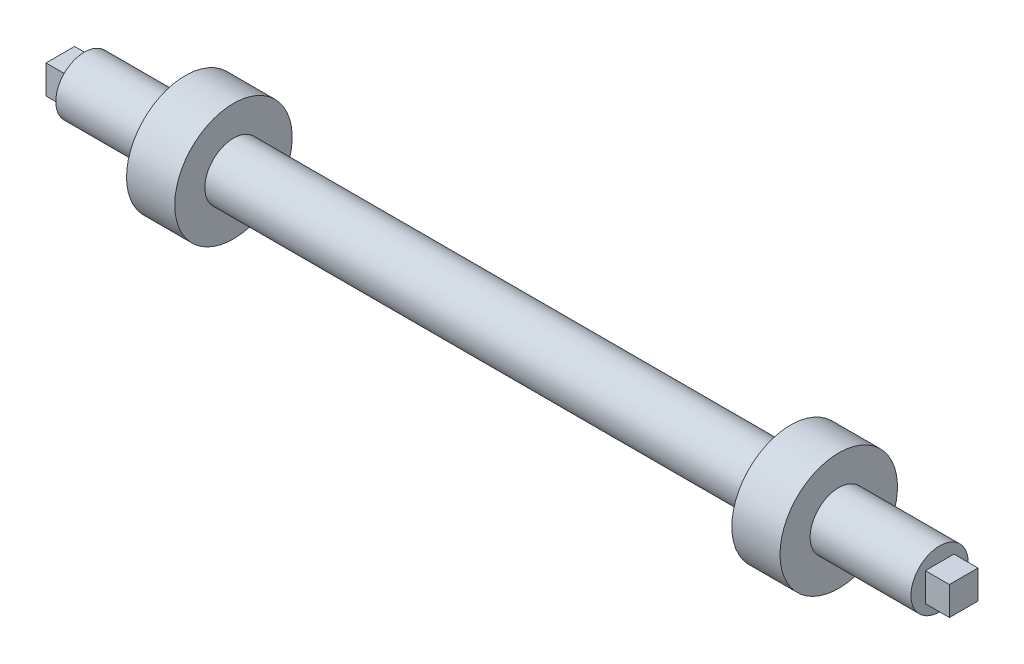
ISO-10303-21;
HEADER;
FILE_DESCRIPTION(('STEP AP214'),'2;1');
FILE_NAME('part.step','',(''),(''),'','','');
FILE_SCHEMA(('AUTOMOTIVE_DESIGN { 1 0 10303 214 1 1 1 1 }'));
ENDSEC;
DATA;
#1=APPLICATION_CONTEXT('core data for automotive mechanical design processes');
#2=APPLICATION_PROTOCOL_DEFINITION('international standard','automotive_design',2000,#1);
#3=PRODUCT_CONTEXT('',#1,'mechanical');
#4=PRODUCT('Part','Part','',(#3));
#5=PRODUCT_RELATED_PRODUCT_CATEGORY('part','',(#4));
#6=PRODUCT_DEFINITION_FORMATION('','',#4);
#7=PRODUCT_DEFINITION_CONTEXT('part definition',#1,'design');
#8=PRODUCT_DEFINITION('design','',#6,#7);
#9=PRODUCT_DEFINITION_SHAPE('','',#8);
#10=(LENGTH_UNIT() NAMED_UNIT(*) SI_UNIT(.MILLI.,.METRE.));
#11=(NAMED_UNIT(*) PLANE_ANGLE_UNIT() SI_UNIT($,.RADIAN.));
#12=(NAMED_UNIT(*) SI_UNIT($,.STERADIAN.) SOLID_ANGLE_UNIT());
#13=UNCERTAINTY_MEASURE_WITH_UNIT(LENGTH_MEASURE(1.E-05),#10,'distance_accuracy_value','');
#14=(GEOMETRIC_REPRESENTATION_CONTEXT(3) GLOBAL_UNCERTAINTY_ASSIGNED_CONTEXT((#13)) GLOBAL_UNIT_ASSIGNED_CONTEXT((#10,
#11,#12)) REPRESENTATION_CONTEXT('',''));
#15=CARTESIAN_POINT('',(0.,0.,0.));
#16=DIRECTION('',(0.,0.,1.));
#17=DIRECTION('',(1.,0.,0.));
#18=AXIS2_PLACEMENT_3D('',#15,#16,#17);
#19=CARTESIAN_POINT('',(0.,0.,-4.75));
#20=DIRECTION('',(-1.,0.,0.));
#21=DIRECTION('',(0.,0.,1.));
#22=AXIS2_PLACEMENT_3D('',#19,#20,#21);
#23=CYLINDRICAL_SURFACE('',#22,4.75);
#24=CARTESIAN_POINT('',(16.75,0.,-4.75));
#25=DIRECTION('',(-1.,0.,0.));
#26=DIRECTION('',(0.,0.,1.));
#27=AXIS2_PLACEMENT_3D('',#24,#25,#26);
#28=CIRCLE('',#27,4.75);
#29=CARTESIAN_POINT('',(16.75,0.,0.));
#30=VERTEX_POINT('',#29);
#31=EDGE_CURVE('E171',#30,#30,#28,.T.);
#32=ORIENTED_EDGE('',*,*,#31,.T.);
#33=EDGE_LOOP('',(#32));
#34=FACE_BOUND('',#33,.T.);
#35=CARTESIAN_POINT('',(0.,0.,-4.75));
#36=DIRECTION('',(-1.,0.,0.));
#37=DIRECTION('',(0.,0.,1.));
#38=AXIS2_PLACEMENT_3D('',#35,#36,#37);
#39=CIRCLE('',#38,4.75);
#40=CARTESIAN_POINT('',(0.,0.,0.));
#41=VERTEX_POINT('',#40);
#42=EDGE_CURVE('E11',#41,#41,#39,.T.);
#43=ORIENTED_EDGE('',*,*,#42,.F.);
#44=EDGE_LOOP('',(#43));
#45=FACE_BOUND('',#44,.T.);
#46=ADVANCED_FACE('F38',(#34,#45),#23,.T.);
#47=CARTESIAN_POINT('',(0.,0.,0.));
#48=DIRECTION('',(-1.,0.,0.));
#49=DIRECTION('',(0.,0.,1.));
#50=AXIS2_PLACEMENT_3D('',#47,#48,#49);
#51=PLANE('',#50);
#52=DIRECTION('',(0.,0.,-1.));
#53=VECTOR('',#52,1.);
#54=CARTESIAN_POINT('',(0.,2.375,-4.75));
#55=LINE('',#54,#53);
#56=CARTESIAN_POINT('',(0.,2.375,-2.375));
#57=VERTEX_POINT('',#56);
#58=CARTESIAN_POINT('',(0.,2.375,-7.125));
#59=VERTEX_POINT('',#58);
#60=EDGE_CURVE('E52',#57,#59,#55,.T.);
#61=ORIENTED_EDGE('',*,*,#60,.F.);
#62=DIRECTION('',(0.,1.,0.));
#63=VECTOR('',#62,1.);
#64=CARTESIAN_POINT('',(0.,-2.375,-2.375));
#65=LINE('',#64,#63);
#66=CARTESIAN_POINT('',(0.,-2.375,-2.375));
#67=VERTEX_POINT('',#66);
#68=EDGE_CURVE('E56',#67,#57,#65,.T.);
#69=ORIENTED_EDGE('',*,*,#68,.F.);
#70=DIRECTION('',(0.,0.,1.));
#71=VECTOR('',#70,1.);
#72=CARTESIAN_POINT('',(0.,-2.375,-7.125));
#73=LINE('',#72,#71);
#74=CARTESIAN_POINT('',(0.,-2.375,-7.125));
#75=VERTEX_POINT('',#74);
#76=EDGE_CURVE('E131',#75,#67,#73,.T.);
#77=ORIENTED_EDGE('',*,*,#76,.F.);
#78=DIRECTION('',(0.,-1.,0.));
#79=VECTOR('',#78,1.);
#80=CARTESIAN_POINT('',(0.,2.375,-7.125));
#81=LINE('',#80,#79);
#82=EDGE_CURVE('E129',#59,#75,#81,.T.);
#83=ORIENTED_EDGE('',*,*,#82,.F.);
#84=EDGE_LOOP('',(#61,#69,#77,#83));
#85=FACE_BOUND('',#84,.T.);
#86=ORIENTED_EDGE('',*,*,#42,.T.);
#87=EDGE_LOOP('',(#86));
#88=FACE_BOUND('',#87,.T.);
#89=ADVANCED_FACE('F202',(#85,#88),#51,.T.);
#90=CARTESIAN_POINT('',(142.,0.,-4.75));
#91=DIRECTION('',(1.,0.,0.));
#92=DIRECTION('',(0.,0.,-1.));
#93=AXIS2_PLACEMENT_3D('',#90,#91,#92);
#94=PLANE('',#93);
#95=DIRECTION('',(0.,0.,1.));
#96=VECTOR('',#95,1.);
#97=CARTESIAN_POINT('',(142.,2.375,-2.375));
#98=LINE('',#97,#96);
#99=CARTESIAN_POINT('',(142.,2.375,-7.125));
#100=VERTEX_POINT('',#99);
#101=CARTESIAN_POINT('',(142.,2.375,-2.375));
#102=VERTEX_POINT('',#101);
#103=EDGE_CURVE('E116',#100,#102,#98,.T.);
#104=ORIENTED_EDGE('',*,*,#103,.F.);
#105=DIRECTION('',(0.,1.,0.));
#106=VECTOR('',#105,1.);
#107=CARTESIAN_POINT('',(142.,2.375,-7.125));
#108=LINE('',#107,#106);
#109=CARTESIAN_POINT('',(142.,-2.375,-7.125));
#110=VERTEX_POINT('',#109);
#111=EDGE_CURVE('E143',#110,#100,#108,.T.);
#112=ORIENTED_EDGE('',*,*,#111,.F.);
#113=DIRECTION('',(0.,0.,-1.));
#114=VECTOR('',#113,1.);
#115=CARTESIAN_POINT('',(142.,-2.375,-7.125));
#116=LINE('',#115,#114);
#117=CARTESIAN_POINT('',(142.,-2.375,-2.375));
#118=VERTEX_POINT('',#117);
#119=EDGE_CURVE('E155',#118,#110,#116,.T.);
#120=ORIENTED_EDGE('',*,*,#119,.F.);
#121=DIRECTION('',(0.,-1.,0.));
#122=VECTOR('',#121,1.);
#123=CARTESIAN_POINT('',(142.,2.375,-2.375));
#124=LINE('',#123,#122);
#125=EDGE_CURVE('E152',#102,#118,#124,.T.);
#126=ORIENTED_EDGE('',*,*,#125,.F.);
#127=EDGE_LOOP('',(#104,#112,#120,#126));
#128=FACE_BOUND('',#127,.T.);
#129=CARTESIAN_POINT('',(142.,0.,-4.75));
#130=DIRECTION('',(-1.,0.,0.));
#131=DIRECTION('',(0.,0.,1.));
#132=AXIS2_PLACEMENT_3D('',#129,#130,#131);
#133=CIRCLE('',#132,4.75);
#134=CARTESIAN_POINT('',(142.,0.,0.));
#135=VERTEX_POINT('',#134);
#136=EDGE_CURVE('E45',#135,#135,#133,.T.);
#137=ORIENTED_EDGE('',*,*,#136,.F.);
#138=EDGE_LOOP('',(#137));
#139=FACE_BOUND('',#138,.T.);
#140=ADVANCED_FACE('F200',(#128,#139),#94,.T.);
#141=CARTESIAN_POINT('',(0.,0.,-4.75));
#142=DIRECTION('',(-1.,0.,0.));
#143=DIRECTION('',(0.,0.,1.));
#144=AXIS2_PLACEMENT_3D('',#141,#142,#143);
#145=CYLINDRICAL_SURFACE('',#144,4.75);
#146=ORIENTED_EDGE('',*,*,#136,.T.);
#147=EDGE_LOOP('',(#146));
#148=FACE_BOUND('',#147,.T.);
#149=CARTESIAN_POINT('',(125.25,0.,-4.75));
#150=DIRECTION('',(-1.,0.,0.));
#151=DIRECTION('',(0.,0.,1.));
#152=AXIS2_PLACEMENT_3D('',#149,#150,#151);
#153=CIRCLE('',#152,4.75);
#154=CARTESIAN_POINT('',(125.25,0.,0.));
#155=VERTEX_POINT('',#154);
#156=EDGE_CURVE('E192',#155,#155,#153,.T.);
#157=ORIENTED_EDGE('',*,*,#156,.F.);
#158=EDGE_LOOP('',(#157));
#159=FACE_BOUND('',#158,.T.);
#160=ADVANCED_FACE('F197',(#148,#159),#145,.T.);
#161=CARTESIAN_POINT('',(125.25,0.,5.));
#162=DIRECTION('',(1.,0.,0.));
#163=DIRECTION('',(0.,0.,-1.));
#164=AXIS2_PLACEMENT_3D('',#161,#162,#163);
#165=PLANE('',#164);
#166=ORIENTED_EDGE('',*,*,#156,.T.);
#167=EDGE_LOOP('',(#166));
#168=FACE_BOUND('',#167,.T.);
#169=CARTESIAN_POINT('',(125.25,0.,-4.75));
#170=DIRECTION('',(-1.,0.,0.));
#171=DIRECTION('',(0.,0.,1.));
#172=AXIS2_PLACEMENT_3D('',#169,#170,#171);
#173=CIRCLE('',#172,9.75);
#174=CARTESIAN_POINT('',(125.25,0.,5.));
#175=VERTEX_POINT('',#174);
#176=EDGE_CURVE('E189',#175,#175,#173,.T.);
#177=ORIENTED_EDGE('',*,*,#176,.F.);
#178=EDGE_LOOP('',(#177));
#179=FACE_BOUND('',#178,.T.);
#180=ADVANCED_FACE('F209',(#168,#179),#165,.T.);
#181=CARTESIAN_POINT('',(0.,0.,-4.75));
#182=DIRECTION('',(-1.,0.,0.));
#183=DIRECTION('',(0.,0.,1.));
#184=AXIS2_PLACEMENT_3D('',#181,#182,#183);
#185=CYLINDRICAL_SURFACE('',#184,9.75);
#186=ORIENTED_EDGE('',*,*,#176,.T.);
#187=EDGE_LOOP('',(#186));
#188=FACE_BOUND('',#187,.T.);
#189=CARTESIAN_POINT('',(117.25,0.,-4.75));
#190=DIRECTION('',(-1.,0.,0.));
#191=DIRECTION('',(0.,0.,1.));
#192=AXIS2_PLACEMENT_3D('',#189,#190,#191);
#193=CIRCLE('',#192,9.75);
#194=CARTESIAN_POINT('',(117.25,0.,5.));
#195=VERTEX_POINT('',#194);
#196=EDGE_CURVE('E186',#195,#195,#193,.T.);
#197=ORIENTED_EDGE('',*,*,#196,.F.);
#198=EDGE_LOOP('',(#197));
#199=FACE_BOUND('',#198,.T.);
#200=ADVANCED_FACE('F248',(#188,#199),#185,.T.);
#201=CARTESIAN_POINT('',(117.25,0.,0.));
#202=DIRECTION('',(-1.,0.,0.));
#203=DIRECTION('',(0.,0.,1.));
#204=AXIS2_PLACEMENT_3D('',#201,#202,#203);
#205=PLANE('',#204);
#206=ORIENTED_EDGE('',*,*,#196,.T.);
#207=EDGE_LOOP('',(#206));
#208=FACE_BOUND('',#207,.T.);
#209=CARTESIAN_POINT('',(117.25,0.,-4.75));
#210=DIRECTION('',(-1.,0.,0.));
#211=DIRECTION('',(0.,0.,1.));
#212=AXIS2_PLACEMENT_3D('',#209,#210,#211);
#213=CIRCLE('',#212,4.75);
#214=CARTESIAN_POINT('',(117.25,0.,0.));
#215=VERTEX_POINT('',#214);
#216=EDGE_CURVE('E183',#215,#215,#213,.T.);
#217=ORIENTED_EDGE('',*,*,#216,.F.);
#218=EDGE_LOOP('',(#217));
#219=FACE_BOUND('',#218,.T.);
#220=ADVANCED_FACE('F244',(#208,#219),#205,.T.);
#221=CARTESIAN_POINT('',(0.,0.,-4.75));
#222=DIRECTION('',(-1.,0.,0.));
#223=DIRECTION('',(0.,0.,1.));
#224=AXIS2_PLACEMENT_3D('',#221,#222,#223);
#225=CYLINDRICAL_SURFACE('',#224,4.75);
#226=ORIENTED_EDGE('',*,*,#216,.T.);
#227=EDGE_LOOP('',(#226));
#228=FACE_BOUND('',#227,.T.);
#229=CARTESIAN_POINT('',(24.75,0.,-4.75));
#230=DIRECTION('',(-1.,0.,0.));
#231=DIRECTION('',(0.,0.,1.));
#232=AXIS2_PLACEMENT_3D('',#229,#230,#231);
#233=CIRCLE('',#232,4.75);
#234=CARTESIAN_POINT('',(24.75,0.,0.));
#235=VERTEX_POINT('',#234);
#236=EDGE_CURVE('E180',#235,#235,#233,.T.);
#237=ORIENTED_EDGE('',*,*,#236,.F.);
#238=EDGE_LOOP('',(#237));
#239=FACE_BOUND('',#238,.T.);
#240=ADVANCED_FACE('F240',(#228,#239),#225,.T.);
#241=CARTESIAN_POINT('',(24.75,0.,5.));
#242=DIRECTION('',(1.,0.,0.));
#243=DIRECTION('',(0.,0.,-1.));
#244=AXIS2_PLACEMENT_3D('',#241,#242,#243);
#245=PLANE('',#244);
#246=ORIENTED_EDGE('',*,*,#236,.T.);
#247=EDGE_LOOP('',(#246));
#248=FACE_BOUND('',#247,.T.);
#249=CARTESIAN_POINT('',(24.75,0.,-4.75));
#250=DIRECTION('',(-1.,0.,0.));
#251=DIRECTION('',(0.,0.,1.));
#252=AXIS2_PLACEMENT_3D('',#249,#250,#251);
#253=CIRCLE('',#252,9.75);
#254=CARTESIAN_POINT('',(24.75,0.,5.));
#255=VERTEX_POINT('',#254);
#256=EDGE_CURVE('E177',#255,#255,#253,.T.);
#257=ORIENTED_EDGE('',*,*,#256,.F.);
#258=EDGE_LOOP('',(#257));
#259=FACE_BOUND('',#258,.T.);
#260=ADVANCED_FACE('F233',(#248,#259),#245,.T.);
#261=CARTESIAN_POINT('',(0.,0.,-4.75));
#262=DIRECTION('',(-1.,0.,0.));
#263=DIRECTION('',(0.,0.,1.));
#264=AXIS2_PLACEMENT_3D('',#261,#262,#263);
#265=CYLINDRICAL_SURFACE('',#264,9.75);
#266=ORIENTED_EDGE('',*,*,#256,.T.);
#267=EDGE_LOOP('',(#266));
#268=FACE_BOUND('',#267,.T.);
#269=CARTESIAN_POINT('',(16.75,0.,-4.75));
#270=DIRECTION('',(-1.,0.,0.));
#271=DIRECTION('',(0.,0.,1.));
#272=AXIS2_PLACEMENT_3D('',#269,#270,#271);
#273=CIRCLE('',#272,9.75);
#274=CARTESIAN_POINT('',(16.75,0.,5.));
#275=VERTEX_POINT('',#274);
#276=EDGE_CURVE('E174',#275,#275,#273,.T.);
#277=ORIENTED_EDGE('',*,*,#276,.F.);
#278=EDGE_LOOP('',(#277));
#279=FACE_BOUND('',#278,.T.);
#280=ADVANCED_FACE('F223',(#268,#279),#265,.T.);
#281=CARTESIAN_POINT('',(16.75,0.,0.));
#282=DIRECTION('',(-1.,0.,0.));
#283=DIRECTION('',(0.,0.,1.));
#284=AXIS2_PLACEMENT_3D('',#281,#282,#283);
#285=PLANE('',#284);
#286=ORIENTED_EDGE('',*,*,#276,.T.);
#287=EDGE_LOOP('',(#286));
#288=FACE_BOUND('',#287,.T.);
#289=ORIENTED_EDGE('',*,*,#31,.F.);
#290=EDGE_LOOP('',(#289));
#291=FACE_BOUND('',#290,.T.);
#292=ADVANCED_FACE('F220',(#288,#291),#285,.T.);
#293=CARTESIAN_POINT('',(146.,2.375,-2.375));
#294=DIRECTION('',(0.,-1.,0.));
#295=DIRECTION('',(0.,0.,-1.));
#296=AXIS2_PLACEMENT_3D('',#293,#294,#295);
#297=PLANE('',#296);
#298=ORIENTED_EDGE('',*,*,#103,.T.);
#299=DIRECTION('',(-1.,0.,0.));
#300=VECTOR('',#299,1.);
#301=CARTESIAN_POINT('',(146.,2.375,-2.375));
#302=LINE('',#301,#300);
#303=CARTESIAN_POINT('',(146.,2.375,-2.375));
#304=VERTEX_POINT('',#303);
#305=EDGE_CURVE('E168',#304,#102,#302,.T.);
#306=ORIENTED_EDGE('',*,*,#305,.F.);
#307=DIRECTION('',(0.,0.,1.));
#308=VECTOR('',#307,1.);
#309=CARTESIAN_POINT('',(146.,2.375,-2.375));
#310=LINE('',#309,#308);
#311=CARTESIAN_POINT('',(146.,2.375,-7.125));
#312=VERTEX_POINT('',#311);
#313=EDGE_CURVE('E139',#312,#304,#310,.T.);
#314=ORIENTED_EDGE('',*,*,#313,.F.);
#315=DIRECTION('',(-1.,0.,0.));
#316=VECTOR('',#315,1.);
#317=CARTESIAN_POINT('',(146.,2.375,-7.125));
#318=LINE('',#317,#316);
#319=EDGE_CURVE('E149',#312,#100,#318,.T.);
#320=ORIENTED_EDGE('',*,*,#319,.T.);
#321=EDGE_LOOP('',(#298,#306,#314,#320));
#322=FACE_BOUND('',#321,.T.);
#323=ADVANCED_FACE('F222',(#322),#297,.F.);
#324=CARTESIAN_POINT('',(146.,2.375,-2.375));
#325=DIRECTION('',(0.,0.,-1.));
#326=DIRECTION('',(0.,1.,0.));
#327=AXIS2_PLACEMENT_3D('',#324,#325,#326);
#328=PLANE('',#327);
#329=ORIENTED_EDGE('',*,*,#125,.T.);
#330=DIRECTION('',(-1.,0.,0.));
#331=VECTOR('',#330,1.);
#332=CARTESIAN_POINT('',(146.,-2.375,-2.375));
#333=LINE('',#332,#331);
#334=CARTESIAN_POINT('',(146.,-2.375,-2.375));
#335=VERTEX_POINT('',#334);
#336=EDGE_CURVE('E165',#335,#118,#333,.T.);
#337=ORIENTED_EDGE('',*,*,#336,.F.);
#338=DIRECTION('',(0.,-1.,0.));
#339=VECTOR('',#338,1.);
#340=CARTESIAN_POINT('',(146.,2.375,-2.375));
#341=LINE('',#340,#339);
#342=EDGE_CURVE('E142',#304,#335,#341,.T.);
#343=ORIENTED_EDGE('',*,*,#342,.F.);
#344=ORIENTED_EDGE('',*,*,#305,.T.);
#345=EDGE_LOOP('',(#329,#337,#343,#344));
#346=FACE_BOUND('',#345,.T.);
#347=ADVANCED_FACE('F230',(#346),#328,.F.);
#348=CARTESIAN_POINT('',(146.,-2.375,-7.125));
#349=DIRECTION('',(0.,1.,0.));
#350=DIRECTION('',(0.,0.,1.));
#351=AXIS2_PLACEMENT_3D('',#348,#349,#350);
#352=PLANE('',#351);
#353=ORIENTED_EDGE('',*,*,#119,.T.);
#354=DIRECTION('',(-1.,0.,0.));
#355=VECTOR('',#354,1.);
#356=CARTESIAN_POINT('',(146.,-2.375,-7.125));
#357=LINE('',#356,#355);
#358=CARTESIAN_POINT('',(146.,-2.375,-7.125));
#359=VERTEX_POINT('',#358);
#360=EDGE_CURVE('E162',#359,#110,#357,.T.);
#361=ORIENTED_EDGE('',*,*,#360,.F.);
#362=DIRECTION('',(0.,0.,-1.));
#363=VECTOR('',#362,1.);
#364=CARTESIAN_POINT('',(146.,-2.375,-7.125));
#365=LINE('',#364,#363);
#366=EDGE_CURVE('E145',#335,#359,#365,.T.);
#367=ORIENTED_EDGE('',*,*,#366,.F.);
#368=ORIENTED_EDGE('',*,*,#336,.T.);
#369=EDGE_LOOP('',(#353,#361,#367,#368));
#370=FACE_BOUND('',#369,.T.);
#371=ADVANCED_FACE('F312',(#370),#352,.F.);
#372=CARTESIAN_POINT('',(146.,2.375,-7.125));
#373=DIRECTION('',(0.,0.,1.));
#374=DIRECTION('',(1.,0.,0.));
#375=AXIS2_PLACEMENT_3D('',#372,#373,#374);
#376=PLANE('',#375);
#377=ORIENTED_EDGE('',*,*,#111,.T.);
#378=ORIENTED_EDGE('',*,*,#319,.F.);
#379=DIRECTION('',(0.,1.,0.));
#380=VECTOR('',#379,1.);
#381=CARTESIAN_POINT('',(146.,2.375,-7.125));
#382=LINE('',#381,#380);
#383=EDGE_CURVE('E147',#359,#312,#382,.T.);
#384=ORIENTED_EDGE('',*,*,#383,.F.);
#385=ORIENTED_EDGE('',*,*,#360,.T.);
#386=EDGE_LOOP('',(#377,#378,#384,#385));
#387=FACE_BOUND('',#386,.T.);
#388=ADVANCED_FACE('F321',(#387),#376,.F.);
#389=CARTESIAN_POINT('',(146.,0.,0.));
#390=DIRECTION('',(-1.,0.,0.));
#391=DIRECTION('',(0.,0.,1.));
#392=AXIS2_PLACEMENT_3D('',#389,#390,#391);
#393=PLANE('',#392);
#394=ORIENTED_EDGE('',*,*,#313,.T.);
#395=ORIENTED_EDGE('',*,*,#342,.T.);
#396=ORIENTED_EDGE('',*,*,#366,.T.);
#397=ORIENTED_EDGE('',*,*,#383,.T.);
#398=EDGE_LOOP('',(#394,#395,#396,#397));
#399=FACE_BOUND('',#398,.T.);
#400=ADVANCED_FACE('F331',(#399),#393,.F.);
#401=CARTESIAN_POINT('',(-4.,2.375,-4.75));
#402=DIRECTION('',(0.,-1.,0.));
#403=DIRECTION('',(0.,0.,-1.));
#404=AXIS2_PLACEMENT_3D('',#401,#402,#403);
#405=PLANE('',#404);
#406=ORIENTED_EDGE('',*,*,#60,.T.);
#407=DIRECTION('',(1.,0.,0.));
#408=VECTOR('',#407,1.);
#409=CARTESIAN_POINT('',(-4.,2.375,-7.125));
#410=LINE('',#409,#408);
#411=CARTESIAN_POINT('',(-4.,2.375,-7.125));
#412=VERTEX_POINT('',#411);
#413=EDGE_CURVE('E112',#412,#59,#410,.T.);
#414=ORIENTED_EDGE('',*,*,#413,.F.);
#415=DIRECTION('',(0.,0.,-1.));
#416=VECTOR('',#415,1.);
#417=CARTESIAN_POINT('',(-4.,2.375,-2.375));
#418=LINE('',#417,#416);
#419=CARTESIAN_POINT('',(-4.,2.375,-2.375));
#420=VERTEX_POINT('',#419);
#421=EDGE_CURVE('E99',#420,#412,#418,.T.);
#422=ORIENTED_EDGE('',*,*,#421,.F.);
#423=DIRECTION('',(1.,0.,0.));
#424=VECTOR('',#423,1.);
#425=CARTESIAN_POINT('',(-4.,2.375,-2.375));
#426=LINE('',#425,#424);
#427=EDGE_CURVE('E127',#420,#57,#426,.T.);
#428=ORIENTED_EDGE('',*,*,#427,.T.);
#429=EDGE_LOOP('',(#406,#414,#422,#428));
#430=FACE_BOUND('',#429,.T.);
#431=ADVANCED_FACE('F113',(#430),#405,.F.);
#432=CARTESIAN_POINT('',(-4.,2.375,-7.125));
#433=DIRECTION('',(0.,0.,1.));
#434=DIRECTION('',(1.,0.,0.));
#435=AXIS2_PLACEMENT_3D('',#432,#433,#434);
#436=PLANE('',#435);
#437=ORIENTED_EDGE('',*,*,#82,.T.);
#438=DIRECTION('',(1.,0.,0.));
#439=VECTOR('',#438,1.);
#440=CARTESIAN_POINT('',(-4.,-2.375,-7.125));
#441=LINE('',#440,#439);
#442=CARTESIAN_POINT('',(-4.,-2.375,-7.125));
#443=VERTEX_POINT('',#442);
#444=EDGE_CURVE('E117',#443,#75,#441,.T.);
#445=ORIENTED_EDGE('',*,*,#444,.F.);
#446=DIRECTION('',(0.,-1.,0.));
#447=VECTOR('',#446,1.);
#448=CARTESIAN_POINT('',(-4.,2.375,-7.125));
#449=LINE('',#448,#447);
#450=EDGE_CURVE('E103',#412,#443,#449,.T.);
#451=ORIENTED_EDGE('',*,*,#450,.F.);
#452=ORIENTED_EDGE('',*,*,#413,.T.);
#453=EDGE_LOOP('',(#437,#445,#451,#452));
#454=FACE_BOUND('',#453,.T.);
#455=ADVANCED_FACE('F119',(#454),#436,.F.);
#456=CARTESIAN_POINT('',(-4.,-2.375,-7.125));
#457=DIRECTION('',(0.,1.,0.));
#458=DIRECTION('',(0.,0.,1.));
#459=AXIS2_PLACEMENT_3D('',#456,#457,#458);
#460=PLANE('',#459);
#461=ORIENTED_EDGE('',*,*,#76,.T.);
#462=DIRECTION('',(1.,0.,0.));
#463=VECTOR('',#462,1.);
#464=CARTESIAN_POINT('',(-4.,-2.375,-2.375));
#465=LINE('',#464,#463);
#466=CARTESIAN_POINT('',(-4.,-2.375,-2.375));
#467=VERTEX_POINT('',#466);
#468=EDGE_CURVE('E135',#467,#67,#465,.T.);
#469=ORIENTED_EDGE('',*,*,#468,.F.);
#470=DIRECTION('',(0.,0.,1.));
#471=VECTOR('',#470,1.);
#472=CARTESIAN_POINT('',(-4.,-2.375,-7.125));
#473=LINE('',#472,#471);
#474=EDGE_CURVE('E122',#443,#467,#473,.T.);
#475=ORIENTED_EDGE('',*,*,#474,.F.);
#476=ORIENTED_EDGE('',*,*,#444,.T.);
#477=EDGE_LOOP('',(#461,#469,#475,#476));
#478=FACE_BOUND('',#477,.T.);
#479=ADVANCED_FACE('F359',(#478),#460,.F.);
#480=CARTESIAN_POINT('',(-4.,-2.375,-2.375));
#481=DIRECTION('',(0.,0.,-1.));
#482=DIRECTION('',(-1.,0.,0.));
#483=AXIS2_PLACEMENT_3D('',#480,#481,#482);
#484=PLANE('',#483);
#485=ORIENTED_EDGE('',*,*,#68,.T.);
#486=ORIENTED_EDGE('',*,*,#427,.F.);
#487=DIRECTION('',(0.,1.,0.));
#488=VECTOR('',#487,1.);
#489=CARTESIAN_POINT('',(-4.,-2.375,-2.375));
#490=LINE('',#489,#488);
#491=EDGE_CURVE('E106',#467,#420,#490,.T.);
#492=ORIENTED_EDGE('',*,*,#491,.F.);
#493=ORIENTED_EDGE('',*,*,#468,.T.);
#494=EDGE_LOOP('',(#485,#486,#492,#493));
#495=FACE_BOUND('',#494,.T.);
#496=ADVANCED_FACE('F368',(#495),#484,.F.);
#497=CARTESIAN_POINT('',(-4.,0.,0.));
#498=DIRECTION('',(-1.,0.,0.));
#499=DIRECTION('',(0.,0.,1.));
#500=AXIS2_PLACEMENT_3D('',#497,#498,#499);
#501=PLANE('',#500);
#502=ORIENTED_EDGE('',*,*,#421,.T.);
#503=ORIENTED_EDGE('',*,*,#450,.T.);
#504=ORIENTED_EDGE('',*,*,#474,.T.);
#505=ORIENTED_EDGE('',*,*,#491,.T.);
#506=EDGE_LOOP('',(#502,#503,#504,#505));
#507=FACE_BOUND('',#506,.T.);
#508=ADVANCED_FACE('F101',(#507),#501,.T.);
#509=CLOSED_SHELL('',(#46,#89,#140,#160,#180,#200,#220,#240,#260,#280,#292,#323,#347,#371,#388,
#400,#431,#455,#479,#496,#508));
#510=MANIFOLD_SOLID_BREP('B2',#509);
#511=ADVANCED_BREP_SHAPE_REPRESENTATION('',(#18,#510),#14);
#512=SHAPE_DEFINITION_REPRESENTATION(#9,#511);
ENDSEC;
END-ISO-10303-21;
